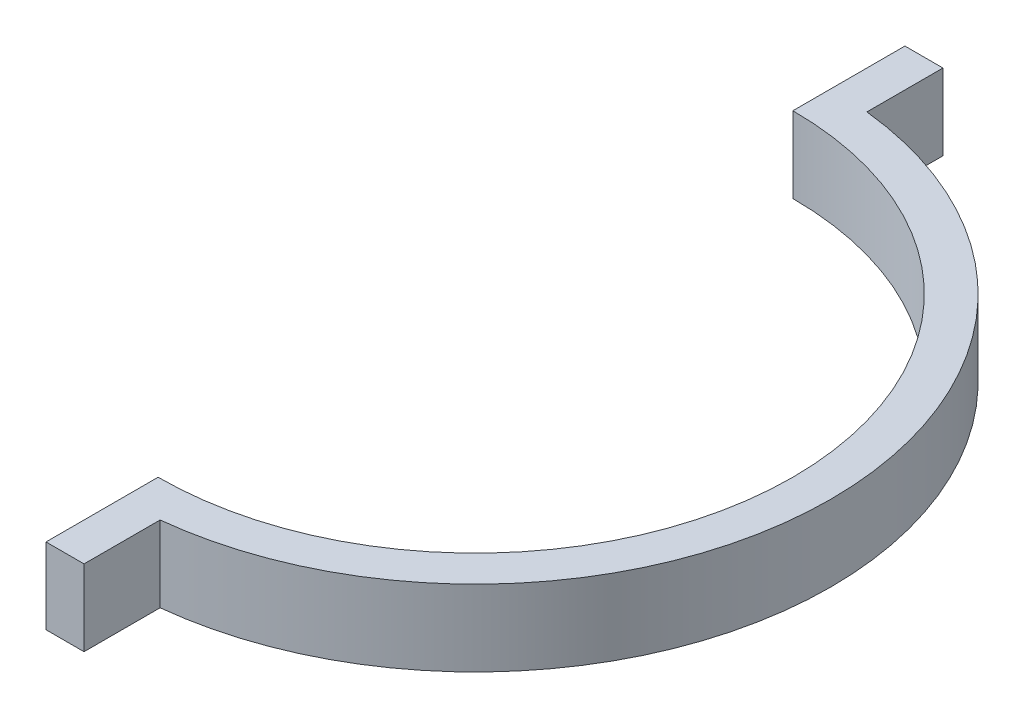
ISO-10303-21;
HEADER;
FILE_DESCRIPTION(('STEP AP214'),'2;1');
FILE_NAME('part.step','',(''),(''),'','','');
FILE_SCHEMA(('AUTOMOTIVE_DESIGN { 1 0 10303 214 1 1 1 1 }'));
ENDSEC;
DATA;
#1=APPLICATION_CONTEXT('core data for automotive mechanical design processes');
#2=APPLICATION_PROTOCOL_DEFINITION('international standard','automotive_design',2000,#1);
#3=PRODUCT_CONTEXT('',#1,'mechanical');
#4=PRODUCT('Part','Part','',(#3));
#5=PRODUCT_RELATED_PRODUCT_CATEGORY('part','',(#4));
#6=PRODUCT_DEFINITION_FORMATION('','',#4);
#7=PRODUCT_DEFINITION_CONTEXT('part definition',#1,'design');
#8=PRODUCT_DEFINITION('design','',#6,#7);
#9=PRODUCT_DEFINITION_SHAPE('','',#8);
#10=(LENGTH_UNIT() NAMED_UNIT(*) SI_UNIT(.MILLI.,.METRE.));
#11=(NAMED_UNIT(*) PLANE_ANGLE_UNIT() SI_UNIT($,.RADIAN.));
#12=(NAMED_UNIT(*) SI_UNIT($,.STERADIAN.) SOLID_ANGLE_UNIT());
#13=UNCERTAINTY_MEASURE_WITH_UNIT(LENGTH_MEASURE(1.E-05),#10,'distance_accuracy_value','');
#14=(GEOMETRIC_REPRESENTATION_CONTEXT(3) GLOBAL_UNCERTAINTY_ASSIGNED_CONTEXT((#13)) GLOBAL_UNIT_ASSIGNED_CONTEXT((#10,
#11,#12)) REPRESENTATION_CONTEXT('',''));
#15=CARTESIAN_POINT('',(0.,0.,0.));
#16=DIRECTION('',(0.,0.,1.));
#17=DIRECTION('',(1.,0.,0.));
#18=AXIS2_PLACEMENT_3D('',#15,#16,#17);
#19=CARTESIAN_POINT('',(0.,12.7,0.));
#20=DIRECTION('',(0.,-1.,0.));
#21=DIRECTION('',(0.,0.,-1.));
#22=AXIS2_PLACEMENT_3D('',#19,#20,#21);
#23=CYLINDRICAL_SURFACE('',#22,52.9913053420005);
#24=CARTESIAN_POINT('',(0.,0.,0.));
#25=DIRECTION('',(0.,-1.,0.));
#26=DIRECTION('',(0.,0.,-1.));
#27=AXIS2_PLACEMENT_3D('',#24,#25,#26);
#28=CIRCLE('',#27,52.9913053420005);
#29=CARTESIAN_POINT('',(0.,0.,-52.9913053420005));
#30=VERTEX_POINT('',#29);
#31=CARTESIAN_POINT('',(0.,0.,52.9913053420005));
#32=VERTEX_POINT('',#31);
#33=EDGE_CURVE('E129',#30,#32,#28,.T.);
#34=ORIENTED_EDGE('',*,*,#33,.T.);
#35=DIRECTION('',(0.,-1.,0.));
#36=VECTOR('',#35,1.);
#37=CARTESIAN_POINT('',(0.,12.7,52.9913053420005));
#38=LINE('',#37,#36);
#39=CARTESIAN_POINT('',(0.,12.7,52.9913053420005));
#40=VERTEX_POINT('',#39);
#41=EDGE_CURVE('E11',#40,#32,#38,.T.);
#42=ORIENTED_EDGE('',*,*,#41,.F.);
#43=CARTESIAN_POINT('',(0.,12.7,0.));
#44=DIRECTION('',(0.,-1.,0.));
#45=DIRECTION('',(0.,0.,-1.));
#46=AXIS2_PLACEMENT_3D('',#43,#44,#45);
#47=CIRCLE('',#46,52.9913053420005);
#48=CARTESIAN_POINT('',(0.,12.7,-52.9913053420005));
#49=VERTEX_POINT('',#48);
#50=EDGE_CURVE('E143',#49,#40,#47,.T.);
#51=ORIENTED_EDGE('',*,*,#50,.F.);
#52=DIRECTION('',(0.,-1.,0.));
#53=VECTOR('',#52,1.);
#54=CARTESIAN_POINT('',(0.,12.7,-52.9913053420005));
#55=LINE('',#54,#53);
#56=EDGE_CURVE('E125',#49,#30,#55,.T.);
#57=ORIENTED_EDGE('',*,*,#56,.T.);
#58=EDGE_LOOP('',(#34,#42,#51,#57));
#59=FACE_BOUND('',#58,.T.);
#60=ADVANCED_FACE('F33',(#59),#23,.F.);
#61=CARTESIAN_POINT('',(0.,12.7,52.9913053420005));
#62=DIRECTION('',(1.,0.,0.));
#63=DIRECTION('',(0.,0.,-1.));
#64=AXIS2_PLACEMENT_3D('',#61,#62,#63);
#65=PLANE('',#64);
#66=DIRECTION('',(0.,0.,1.));
#67=VECTOR('',#66,1.);
#68=CARTESIAN_POINT('',(0.,0.,52.9913053420005));
#69=LINE('',#68,#67);
#70=CARTESIAN_POINT('',(0.,0.,71.7005764352564));
#71=VERTEX_POINT('',#70);
#72=EDGE_CURVE('E132',#32,#71,#69,.T.);
#73=ORIENTED_EDGE('',*,*,#72,.T.);
#74=DIRECTION('',(0.,-1.,0.));
#75=VECTOR('',#74,1.);
#76=CARTESIAN_POINT('',(0.,12.7,71.7005764352564));
#77=LINE('',#76,#75);
#78=CARTESIAN_POINT('',(0.,12.7,71.7005764352564));
#79=VERTEX_POINT('',#78);
#80=EDGE_CURVE('E41',#79,#71,#77,.T.);
#81=ORIENTED_EDGE('',*,*,#80,.F.);
#82=DIRECTION('',(0.,0.,1.));
#83=VECTOR('',#82,1.);
#84=CARTESIAN_POINT('',(0.,12.7,52.9913053420005));
#85=LINE('',#84,#83);
#86=EDGE_CURVE('E92',#40,#79,#85,.T.);
#87=ORIENTED_EDGE('',*,*,#86,.F.);
#88=ORIENTED_EDGE('',*,*,#41,.T.);
#89=EDGE_LOOP('',(#73,#81,#87,#88));
#90=FACE_BOUND('',#89,.T.);
#91=ADVANCED_FACE('F178',(#90),#65,.F.);
#92=CARTESIAN_POINT('',(0.,12.7,71.7005764352564));
#93=DIRECTION('',(0.,0.,-1.));
#94=DIRECTION('',(-1.,0.,0.));
#95=AXIS2_PLACEMENT_3D('',#92,#93,#94);
#96=PLANE('',#95);
#97=DIRECTION('',(1.,0.,0.));
#98=VECTOR('',#97,1.);
#99=CARTESIAN_POINT('',(0.,0.,71.7005764352564));
#100=LINE('',#99,#98);
#101=CARTESIAN_POINT('',(6.35,0.,71.7005764352564));
#102=VERTEX_POINT('',#101);
#103=EDGE_CURVE('E134',#71,#102,#100,.T.);
#104=ORIENTED_EDGE('',*,*,#103,.T.);
#105=DIRECTION('',(0.,-1.,0.));
#106=VECTOR('',#105,1.);
#107=CARTESIAN_POINT('',(6.35,12.7,71.7005764352564));
#108=LINE('',#107,#106);
#109=CARTESIAN_POINT('',(6.35,12.7,71.7005764352564));
#110=VERTEX_POINT('',#109);
#111=EDGE_CURVE('E150',#110,#102,#108,.T.);
#112=ORIENTED_EDGE('',*,*,#111,.F.);
#113=DIRECTION('',(1.,0.,0.));
#114=VECTOR('',#113,1.);
#115=CARTESIAN_POINT('',(0.,12.7,71.7005764352564));
#116=LINE('',#115,#114);
#117=EDGE_CURVE('E158',#79,#110,#116,.T.);
#118=ORIENTED_EDGE('',*,*,#117,.F.);
#119=ORIENTED_EDGE('',*,*,#80,.T.);
#120=EDGE_LOOP('',(#104,#112,#118,#119));
#121=FACE_BOUND('',#120,.T.);
#122=ADVANCED_FACE('F156',(#121),#96,.F.);
#123=CARTESIAN_POINT('',(6.35,12.7,71.7005764352564));
#124=DIRECTION('',(-1.,0.,0.));
#125=DIRECTION('',(0.,0.,1.));
#126=AXIS2_PLACEMENT_3D('',#123,#124,#125);
#127=PLANE('',#126);
#128=DIRECTION('',(0.,0.,-1.));
#129=VECTOR('',#128,1.);
#130=CARTESIAN_POINT('',(6.35,0.,71.7005764352564));
#131=LINE('',#130,#129);
#132=CARTESIAN_POINT('',(6.35000000000001,0.,59.0005764352564));
#133=VERTEX_POINT('',#132);
#134=EDGE_CURVE('E136',#102,#133,#131,.T.);
#135=ORIENTED_EDGE('',*,*,#134,.T.);
#136=DIRECTION('',(0.,-1.,0.));
#137=VECTOR('',#136,1.);
#138=CARTESIAN_POINT('',(6.35000000000001,12.7,59.0005764352564));
#139=LINE('',#138,#137);
#140=CARTESIAN_POINT('',(6.35000000000001,12.7,59.0005764352564));
#141=VERTEX_POINT('',#140);
#142=EDGE_CURVE('E147',#141,#133,#139,.T.);
#143=ORIENTED_EDGE('',*,*,#142,.F.);
#144=DIRECTION('',(0.,0.,-1.));
#145=VECTOR('',#144,1.);
#146=CARTESIAN_POINT('',(6.35,12.7,71.7005764352564));
#147=LINE('',#146,#145);
#148=EDGE_CURVE('E170',#110,#141,#147,.T.);
#149=ORIENTED_EDGE('',*,*,#148,.F.);
#150=ORIENTED_EDGE('',*,*,#111,.T.);
#151=EDGE_LOOP('',(#135,#143,#149,#150));
#152=FACE_BOUND('',#151,.T.);
#153=ADVANCED_FACE('F166',(#152),#127,.F.);
#154=CARTESIAN_POINT('',(0.,12.7,0.));
#155=DIRECTION('',(0.,-1.,0.));
#156=DIRECTION('',(0.,0.,-1.));
#157=AXIS2_PLACEMENT_3D('',#154,#155,#156);
#158=CYLINDRICAL_SURFACE('',#157,59.3413053420005);
#159=CARTESIAN_POINT('',(0.,0.,0.));
#160=DIRECTION('',(0.,1.,0.));
#161=DIRECTION('',(0.,0.,-1.));
#162=AXIS2_PLACEMENT_3D('',#159,#160,#161);
#163=CIRCLE('',#162,59.3413053420005);
#164=CARTESIAN_POINT('',(6.35,0.,-59.0005764352564));
#165=VERTEX_POINT('',#164);
#166=EDGE_CURVE('E138',#133,#165,#163,.T.);
#167=ORIENTED_EDGE('',*,*,#166,.T.);
#168=DIRECTION('',(0.,-1.,0.));
#169=VECTOR('',#168,1.);
#170=CARTESIAN_POINT('',(6.35,12.7,-59.0005764352564));
#171=LINE('',#170,#169);
#172=CARTESIAN_POINT('',(6.35,12.7,-59.0005764352564));
#173=VERTEX_POINT('',#172);
#174=EDGE_CURVE('E120',#173,#165,#171,.T.);
#175=ORIENTED_EDGE('',*,*,#174,.F.);
#176=CARTESIAN_POINT('',(0.,12.7,0.));
#177=DIRECTION('',(0.,1.,0.));
#178=DIRECTION('',(0.,0.,-1.));
#179=AXIS2_PLACEMENT_3D('',#176,#177,#178);
#180=CIRCLE('',#179,59.3413053420005);
#181=EDGE_CURVE('E111',#141,#173,#180,.T.);
#182=ORIENTED_EDGE('',*,*,#181,.F.);
#183=ORIENTED_EDGE('',*,*,#142,.T.);
#184=EDGE_LOOP('',(#167,#175,#182,#183));
#185=FACE_BOUND('',#184,.T.);
#186=ADVANCED_FACE('F169',(#185),#158,.T.);
#187=CARTESIAN_POINT('',(6.35,12.7,-71.7005764352564));
#188=DIRECTION('',(-1.,0.,0.));
#189=DIRECTION('',(0.,0.,1.));
#190=AXIS2_PLACEMENT_3D('',#187,#188,#189);
#191=PLANE('',#190);
#192=DIRECTION('',(0.,0.,-1.));
#193=VECTOR('',#192,1.);
#194=CARTESIAN_POINT('',(6.35,0.,-71.7005764352564));
#195=LINE('',#194,#193);
#196=CARTESIAN_POINT('',(6.35,0.,-71.7005764352564));
#197=VERTEX_POINT('',#196);
#198=EDGE_CURVE('E119',#165,#197,#195,.T.);
#199=ORIENTED_EDGE('',*,*,#198,.T.);
#200=DIRECTION('',(0.,-1.,0.));
#201=VECTOR('',#200,1.);
#202=CARTESIAN_POINT('',(6.35,12.7,-71.7005764352564));
#203=LINE('',#202,#201);
#204=CARTESIAN_POINT('',(6.35,12.7,-71.7005764352564));
#205=VERTEX_POINT('',#204);
#206=EDGE_CURVE('E116',#205,#197,#203,.T.);
#207=ORIENTED_EDGE('',*,*,#206,.F.);
#208=DIRECTION('',(0.,0.,-1.));
#209=VECTOR('',#208,1.);
#210=CARTESIAN_POINT('',(6.35,12.7,-71.7005764352564));
#211=LINE('',#210,#209);
#212=EDGE_CURVE('E105',#173,#205,#211,.T.);
#213=ORIENTED_EDGE('',*,*,#212,.F.);
#214=ORIENTED_EDGE('',*,*,#174,.T.);
#215=EDGE_LOOP('',(#199,#207,#213,#214));
#216=FACE_BOUND('',#215,.T.);
#217=ADVANCED_FACE('F117',(#216),#191,.F.);
#218=CARTESIAN_POINT('',(0.,12.7,-71.7005764352564));
#219=DIRECTION('',(0.,0.,1.));
#220=DIRECTION('',(1.,0.,0.));
#221=AXIS2_PLACEMENT_3D('',#218,#219,#220);
#222=PLANE('',#221);
#223=DIRECTION('',(-1.,0.,0.));
#224=VECTOR('',#223,1.);
#225=CARTESIAN_POINT('',(0.,0.,-71.7005764352564));
#226=LINE('',#225,#224);
#227=CARTESIAN_POINT('',(0.,0.,-71.7005764352564));
#228=VERTEX_POINT('',#227);
#229=EDGE_CURVE('E78',#197,#228,#226,.T.);
#230=ORIENTED_EDGE('',*,*,#229,.T.);
#231=DIRECTION('',(0.,-1.,0.));
#232=VECTOR('',#231,1.);
#233=CARTESIAN_POINT('',(0.,12.7,-71.7005764352564));
#234=LINE('',#233,#232);
#235=CARTESIAN_POINT('',(0.,12.7,-71.7005764352564));
#236=VERTEX_POINT('',#235);
#237=EDGE_CURVE('E121',#236,#228,#234,.T.);
#238=ORIENTED_EDGE('',*,*,#237,.F.);
#239=DIRECTION('',(-1.,0.,0.));
#240=VECTOR('',#239,1.);
#241=CARTESIAN_POINT('',(0.,12.7,-71.7005764352564));
#242=LINE('',#241,#240);
#243=EDGE_CURVE('E109',#205,#236,#242,.T.);
#244=ORIENTED_EDGE('',*,*,#243,.F.);
#245=ORIENTED_EDGE('',*,*,#206,.T.);
#246=EDGE_LOOP('',(#230,#238,#244,#245));
#247=FACE_BOUND('',#246,.T.);
#248=ADVANCED_FACE('F123',(#247),#222,.F.);
#249=CARTESIAN_POINT('',(0.,12.7,-52.9913053420005));
#250=DIRECTION('',(1.,0.,0.));
#251=DIRECTION('',(0.,0.,-1.));
#252=AXIS2_PLACEMENT_3D('',#249,#250,#251);
#253=PLANE('',#252);
#254=DIRECTION('',(0.,0.,1.));
#255=VECTOR('',#254,1.);
#256=CARTESIAN_POINT('',(0.,0.,-52.9913053420005));
#257=LINE('',#256,#255);
#258=EDGE_CURVE('E84',#228,#30,#257,.T.);
#259=ORIENTED_EDGE('',*,*,#258,.T.);
#260=ORIENTED_EDGE('',*,*,#56,.F.);
#261=DIRECTION('',(0.,0.,1.));
#262=VECTOR('',#261,1.);
#263=CARTESIAN_POINT('',(0.,12.7,-52.9913053420005));
#264=LINE('',#263,#262);
#265=EDGE_CURVE('E49',#236,#49,#264,.T.);
#266=ORIENTED_EDGE('',*,*,#265,.F.);
#267=ORIENTED_EDGE('',*,*,#237,.T.);
#268=EDGE_LOOP('',(#259,#260,#266,#267));
#269=FACE_BOUND('',#268,.T.);
#270=ADVANCED_FACE('F194',(#269),#253,.F.);
#271=CARTESIAN_POINT('',(0.,12.7,0.));
#272=DIRECTION('',(0.,-1.,0.));
#273=DIRECTION('',(0.,0.,-1.));
#274=AXIS2_PLACEMENT_3D('',#271,#272,#273);
#275=PLANE('',#274);
#276=ORIENTED_EDGE('',*,*,#50,.T.);
#277=ORIENTED_EDGE('',*,*,#86,.T.);
#278=ORIENTED_EDGE('',*,*,#117,.T.);
#279=ORIENTED_EDGE('',*,*,#148,.T.);
#280=ORIENTED_EDGE('',*,*,#181,.T.);
#281=ORIENTED_EDGE('',*,*,#212,.T.);
#282=ORIENTED_EDGE('',*,*,#243,.T.);
#283=ORIENTED_EDGE('',*,*,#265,.T.);
#284=EDGE_LOOP('',(#276,#277,#278,#279,#280,#281,#282,#283));
#285=FACE_BOUND('',#284,.T.);
#286=ADVANCED_FACE('F107',(#285),#275,.F.);
#287=CARTESIAN_POINT('',(0.,0.,0.));
#288=DIRECTION('',(0.,-1.,0.));
#289=DIRECTION('',(0.,0.,-1.));
#290=AXIS2_PLACEMENT_3D('',#287,#288,#289);
#291=PLANE('',#290);
#292=ORIENTED_EDGE('',*,*,#33,.F.);
#293=ORIENTED_EDGE('',*,*,#258,.F.);
#294=ORIENTED_EDGE('',*,*,#229,.F.);
#295=ORIENTED_EDGE('',*,*,#198,.F.);
#296=ORIENTED_EDGE('',*,*,#166,.F.);
#297=ORIENTED_EDGE('',*,*,#134,.F.);
#298=ORIENTED_EDGE('',*,*,#103,.F.);
#299=ORIENTED_EDGE('',*,*,#72,.F.);
#300=EDGE_LOOP('',(#292,#293,#294,#295,#296,#297,#298,#299));
#301=FACE_BOUND('',#300,.T.);
#302=ADVANCED_FACE('F162',(#301),#291,.T.);
#303=CLOSED_SHELL('',(#60,#91,#122,#153,#186,#217,#248,#270,#286,#302));
#304=MANIFOLD_SOLID_BREP('B2',#303);
#305=ADVANCED_BREP_SHAPE_REPRESENTATION('',(#18,#304),#14);
#306=SHAPE_DEFINITION_REPRESENTATION(#9,#305);
ENDSEC;
END-ISO-10303-21;
